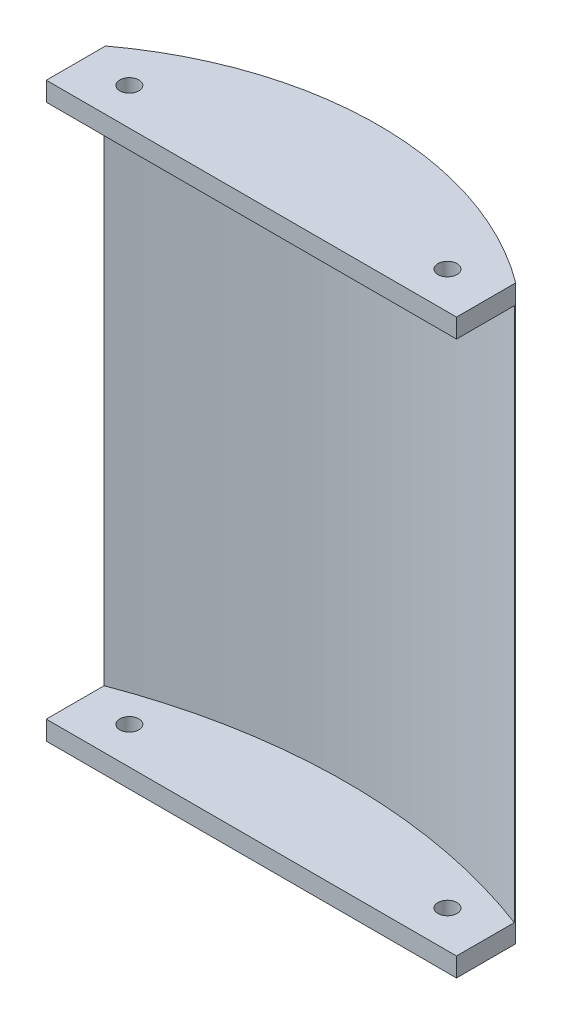
ISO-10303-21;
HEADER;
FILE_DESCRIPTION(('STEP AP214'),'2;1');
FILE_NAME('part.step','',(''),(''),'','','');
FILE_SCHEMA(('AUTOMOTIVE_DESIGN { 1 0 10303 214 1 1 1 1 }'));
ENDSEC;
DATA;
#1=APPLICATION_CONTEXT('core data for automotive mechanical design processes');
#2=APPLICATION_PROTOCOL_DEFINITION('international standard','automotive_design',2000,#1);
#3=PRODUCT_CONTEXT('',#1,'mechanical');
#4=PRODUCT('Part','Part','',(#3));
#5=PRODUCT_RELATED_PRODUCT_CATEGORY('part','',(#4));
#6=PRODUCT_DEFINITION_FORMATION('','',#4);
#7=PRODUCT_DEFINITION_CONTEXT('part definition',#1,'design');
#8=PRODUCT_DEFINITION('design','',#6,#7);
#9=PRODUCT_DEFINITION_SHAPE('','',#8);
#10=(LENGTH_UNIT() NAMED_UNIT(*) SI_UNIT(.MILLI.,.METRE.));
#11=(NAMED_UNIT(*) PLANE_ANGLE_UNIT() SI_UNIT($,.RADIAN.));
#12=(NAMED_UNIT(*) SI_UNIT($,.STERADIAN.) SOLID_ANGLE_UNIT());
#13=UNCERTAINTY_MEASURE_WITH_UNIT(LENGTH_MEASURE(1.E-05),#10,'distance_accuracy_value','');
#14=(GEOMETRIC_REPRESENTATION_CONTEXT(3) GLOBAL_UNCERTAINTY_ASSIGNED_CONTEXT((#13)) GLOBAL_UNIT_ASSIGNED_CONTEXT((#10,
#11,#12)) REPRESENTATION_CONTEXT('',''));
#15=CARTESIAN_POINT('',(0.,0.,0.));
#16=DIRECTION('',(0.,0.,1.));
#17=DIRECTION('',(1.,0.,0.));
#18=AXIS2_PLACEMENT_3D('',#15,#16,#17);
#19=CARTESIAN_POINT('',(64.5,90.,0.));
#20=DIRECTION('',(-1.,0.,0.));
#21=DIRECTION('',(0.,0.,1.));
#22=AXIS2_PLACEMENT_3D('',#19,#20,#21);
#23=PLANE('',#22);
#24=DIRECTION('',(0.,0.,1.));
#25=VECTOR('',#24,1.);
#26=CARTESIAN_POINT('',(64.5,87.,0.));
#27=LINE('',#26,#25);
#28=CARTESIAN_POINT('',(64.5,87.,-9.09369835657632));
#29=VERTEX_POINT('',#28);
#30=CARTESIAN_POINT('',(64.5,87.,0.));
#31=VERTEX_POINT('',#30);
#32=EDGE_CURVE('E139',#29,#31,#27,.T.);
#33=ORIENTED_EDGE('',*,*,#32,.F.);
#34=DIRECTION('',(0.,1.,0.));
#35=VECTOR('',#34,1.);
#36=CARTESIAN_POINT('',(64.5,87.,-9.09369835657632));
#37=LINE('',#36,#35);
#38=CARTESIAN_POINT('',(64.5,2.99999999999999,-9.09369835657632));
#39=VERTEX_POINT('',#38);
#40=EDGE_CURVE('E131',#29,#39,#37,.F.);
#41=ORIENTED_EDGE('',*,*,#40,.T.);
#42=DIRECTION('',(0.,0.,1.));
#43=VECTOR('',#42,1.);
#44=CARTESIAN_POINT('',(64.5,2.99999999999999,0.));
#45=LINE('',#44,#43);
#46=CARTESIAN_POINT('',(64.5,2.99999999999999,0.));
#47=VERTEX_POINT('',#46);
#48=EDGE_CURVE('E119',#39,#47,#45,.T.);
#49=ORIENTED_EDGE('',*,*,#48,.T.);
#50=DIRECTION('',(0.,-1.,0.));
#51=VECTOR('',#50,1.);
#52=CARTESIAN_POINT('',(64.5,90.,0.));
#53=LINE('',#52,#51);
#54=CARTESIAN_POINT('',(64.5,0.,0.));
#55=VERTEX_POINT('',#54);
#56=EDGE_CURVE('E92',#47,#55,#53,.T.);
#57=ORIENTED_EDGE('',*,*,#56,.T.);
#58=DIRECTION('',(0.,0.,-1.));
#59=VECTOR('',#58,1.);
#60=CARTESIAN_POINT('',(64.5,0.,0.));
#61=LINE('',#60,#59);
#62=CARTESIAN_POINT('',(64.5,0.,-9.3120941539427));
#63=VERTEX_POINT('',#62);
#64=EDGE_CURVE('E141',#55,#63,#61,.T.);
#65=ORIENTED_EDGE('',*,*,#64,.T.);
#66=DIRECTION('',(0.,-1.,0.));
#67=VECTOR('',#66,1.);
#68=CARTESIAN_POINT('',(64.5,90.,-9.3120941539427));
#69=LINE('',#68,#67);
#70=CARTESIAN_POINT('',(64.5,90.,-9.3120941539427));
#71=VERTEX_POINT('',#70);
#72=EDGE_CURVE('E182',#71,#63,#69,.T.);
#73=ORIENTED_EDGE('',*,*,#72,.F.);
#74=DIRECTION('',(0.,0.,-1.));
#75=VECTOR('',#74,1.);
#76=CARTESIAN_POINT('',(64.5,90.,0.));
#77=LINE('',#76,#75);
#78=CARTESIAN_POINT('',(64.5,90.,0.));
#79=VERTEX_POINT('',#78);
#80=EDGE_CURVE('E150',#79,#71,#77,.T.);
#81=ORIENTED_EDGE('',*,*,#80,.F.);
#82=EDGE_CURVE('E171',#79,#31,#53,.T.);
#83=ORIENTED_EDGE('',*,*,#82,.T.);
#84=EDGE_LOOP('',(#33,#41,#49,#57,#65,#73,#81,#83));
#85=FACE_BOUND('',#84,.T.);
#86=ADVANCED_FACE('F43',(#85),#23,.F.);
#87=CARTESIAN_POINT('',(0.,90.,0.));
#88=DIRECTION('',(-1.,0.,0.));
#89=DIRECTION('',(0.,0.,1.));
#90=AXIS2_PLACEMENT_3D('',#87,#88,#89);
#91=PLANE('',#90);
#92=DIRECTION('',(0.,1.,0.));
#93=VECTOR('',#92,1.);
#94=CARTESIAN_POINT('',(0.,87.,-9.09369835657632));
#95=LINE('',#94,#93);
#96=CARTESIAN_POINT('',(0.,87.,-9.09369835657632));
#97=VERTEX_POINT('',#96);
#98=CARTESIAN_POINT('',(0.,2.99999999999999,-9.09369835657632));
#99=VERTEX_POINT('',#98);
#100=EDGE_CURVE('E11',#97,#99,#95,.F.);
#101=ORIENTED_EDGE('',*,*,#100,.F.);
#102=DIRECTION('',(0.,0.,1.));
#103=VECTOR('',#102,1.);
#104=CARTESIAN_POINT('',(0.,87.,0.));
#105=LINE('',#104,#103);
#106=CARTESIAN_POINT('',(0.,87.,0.));
#107=VERTEX_POINT('',#106);
#108=EDGE_CURVE('E126',#97,#107,#105,.T.);
#109=ORIENTED_EDGE('',*,*,#108,.T.);
#110=DIRECTION('',(0.,-1.,0.));
#111=VECTOR('',#110,1.);
#112=CARTESIAN_POINT('',(0.,90.,0.));
#113=LINE('',#112,#111);
#114=CARTESIAN_POINT('',(0.,90.,0.));
#115=VERTEX_POINT('',#114);
#116=EDGE_CURVE('E175',#115,#107,#113,.T.);
#117=ORIENTED_EDGE('',*,*,#116,.F.);
#118=DIRECTION('',(0.,0.,-1.));
#119=VECTOR('',#118,1.);
#120=CARTESIAN_POINT('',(0.,90.,0.));
#121=LINE('',#120,#119);
#122=CARTESIAN_POINT('',(0.,90.,-9.31209415394272));
#123=VERTEX_POINT('',#122);
#124=EDGE_CURVE('E156',#115,#123,#121,.T.);
#125=ORIENTED_EDGE('',*,*,#124,.T.);
#126=DIRECTION('',(0.,-1.,0.));
#127=VECTOR('',#126,1.);
#128=CARTESIAN_POINT('',(0.,90.,-9.31209415394272));
#129=LINE('',#128,#127);
#130=CARTESIAN_POINT('',(0.,0.,-9.31209415394272));
#131=VERTEX_POINT('',#130);
#132=EDGE_CURVE('E179',#123,#131,#129,.T.);
#133=ORIENTED_EDGE('',*,*,#132,.T.);
#134=DIRECTION('',(0.,0.,-1.));
#135=VECTOR('',#134,1.);
#136=CARTESIAN_POINT('',(0.,0.,0.));
#137=LINE('',#136,#135);
#138=CARTESIAN_POINT('',(0.,0.,0.));
#139=VERTEX_POINT('',#138);
#140=EDGE_CURVE('E165',#139,#131,#137,.T.);
#141=ORIENTED_EDGE('',*,*,#140,.F.);
#142=CARTESIAN_POINT('',(0.,3.00000000000002,0.));
#143=VERTEX_POINT('',#142);
#144=EDGE_CURVE('E174',#143,#139,#113,.T.);
#145=ORIENTED_EDGE('',*,*,#144,.F.);
#146=DIRECTION('',(0.,0.,1.));
#147=VECTOR('',#146,1.);
#148=CARTESIAN_POINT('',(0.,2.99999999999999,0.));
#149=LINE('',#148,#147);
#150=EDGE_CURVE('E60',#99,#143,#149,.T.);
#151=ORIENTED_EDGE('',*,*,#150,.F.);
#152=EDGE_LOOP('',(#101,#109,#117,#125,#133,#141,#145,#151));
#153=FACE_BOUND('',#152,.T.);
#154=ADVANCED_FACE('F226',(#153),#91,.T.);
#155=CARTESIAN_POINT('',(0.,90.,0.));
#156=DIRECTION('',(0.,0.,-1.));
#157=DIRECTION('',(-1.,0.,0.));
#158=AXIS2_PLACEMENT_3D('',#155,#156,#157);
#159=PLANE('',#158);
#160=DIRECTION('',(-1.,0.,0.));
#161=VECTOR('',#160,1.);
#162=CARTESIAN_POINT('',(0.,87.,0.));
#163=LINE('',#162,#161);
#164=EDGE_CURVE('E52',#31,#107,#163,.T.);
#165=ORIENTED_EDGE('',*,*,#164,.F.);
#166=ORIENTED_EDGE('',*,*,#82,.F.);
#167=DIRECTION('',(1.,0.,0.));
#168=VECTOR('',#167,1.);
#169=CARTESIAN_POINT('',(0.,90.,0.));
#170=LINE('',#169,#168);
#171=EDGE_CURVE('E69',#115,#79,#170,.T.);
#172=ORIENTED_EDGE('',*,*,#171,.F.);
#173=ORIENTED_EDGE('',*,*,#116,.T.);
#174=EDGE_LOOP('',(#165,#166,#172,#173));
#175=FACE_BOUND('',#174,.T.);
#176=ADVANCED_FACE('F230',(#175),#159,.F.);
#177=CARTESIAN_POINT('',(32.25,90.,34.));
#178=DIRECTION('',(0.,-1.,0.));
#179=DIRECTION('',(0.,0.,-1.));
#180=AXIS2_PLACEMENT_3D('',#177,#178,#179);
#181=CYLINDRICAL_SURFACE('',#180,54.);
#182=CARTESIAN_POINT('',(32.25,0.,34.));
#183=DIRECTION('',(0.,1.,0.));
#184=DIRECTION('',(0.,0.,1.));
#185=AXIS2_PLACEMENT_3D('',#182,#183,#184);
#186=CIRCLE('',#185,54.);
#187=EDGE_CURVE('E145',#63,#131,#186,.T.);
#188=ORIENTED_EDGE('',*,*,#187,.T.);
#189=ORIENTED_EDGE('',*,*,#132,.F.);
#190=CARTESIAN_POINT('',(32.25,90.,34.));
#191=DIRECTION('',(0.,1.,0.));
#192=DIRECTION('',(0.,0.,1.));
#193=AXIS2_PLACEMENT_3D('',#190,#191,#192);
#194=CIRCLE('',#193,54.);
#195=EDGE_CURVE('E100',#71,#123,#194,.T.);
#196=ORIENTED_EDGE('',*,*,#195,.F.);
#197=ORIENTED_EDGE('',*,*,#72,.T.);
#198=EDGE_LOOP('',(#188,#189,#196,#197));
#199=FACE_BOUND('',#198,.T.);
#200=ADVANCED_FACE('F235',(#199),#181,.T.);
#201=ORIENTED_EDGE('',*,*,#56,.F.);
#202=DIRECTION('',(-1.,0.,0.));
#203=VECTOR('',#202,1.);
#204=CARTESIAN_POINT('',(0.,2.99999999999999,0.));
#205=LINE('',#204,#203);
#206=EDGE_CURVE('E123',#47,#143,#205,.T.);
#207=ORIENTED_EDGE('',*,*,#206,.T.);
#208=ORIENTED_EDGE('',*,*,#144,.T.);
#209=DIRECTION('',(1.,0.,0.));
#210=VECTOR('',#209,1.);
#211=CARTESIAN_POINT('',(0.,0.,0.));
#212=LINE('',#211,#210);
#213=EDGE_CURVE('E153',#139,#55,#212,.T.);
#214=ORIENTED_EDGE('',*,*,#213,.T.);
#215=EDGE_LOOP('',(#201,#207,#208,#214));
#216=FACE_BOUND('',#215,.T.);
#217=ADVANCED_FACE('F242',(#216),#159,.F.);
#218=CARTESIAN_POINT('',(32.25,90.,34.));
#219=DIRECTION('',(0.,1.,0.));
#220=DIRECTION('',(0.,0.,1.));
#221=AXIS2_PLACEMENT_3D('',#218,#219,#220);
#222=PLANE('',#221);
#223=CARTESIAN_POINT('',(7.24,90.,-5.82));
#224=DIRECTION('',(0.,1.,0.));
#225=DIRECTION('',(0.,0.,1.));
#226=AXIS2_PLACEMENT_3D('',#223,#224,#225);
#227=CIRCLE('',#226,1.5);
#228=CARTESIAN_POINT('',(7.24,90.,-4.32));
#229=VERTEX_POINT('',#228);
#230=EDGE_CURVE('E200',#229,#229,#227,.T.);
#231=ORIENTED_EDGE('',*,*,#230,.F.);
#232=EDGE_LOOP('',(#231));
#233=FACE_BOUND('',#232,.T.);
#234=CARTESIAN_POINT('',(57.26,90.,-5.82));
#235=DIRECTION('',(0.,1.,0.));
#236=DIRECTION('',(0.,0.,1.));
#237=AXIS2_PLACEMENT_3D('',#234,#235,#236);
#238=CIRCLE('',#237,1.5);
#239=CARTESIAN_POINT('',(57.26,90.,-4.31999999999999));
#240=VERTEX_POINT('',#239);
#241=EDGE_CURVE('E206',#240,#240,#238,.T.);
#242=ORIENTED_EDGE('',*,*,#241,.F.);
#243=EDGE_LOOP('',(#242));
#244=FACE_BOUND('',#243,.T.);
#245=ORIENTED_EDGE('',*,*,#80,.T.);
#246=ORIENTED_EDGE('',*,*,#195,.T.);
#247=ORIENTED_EDGE('',*,*,#124,.F.);
#248=ORIENTED_EDGE('',*,*,#171,.T.);
#249=EDGE_LOOP('',(#245,#246,#247,#248));
#250=FACE_BOUND('',#249,.T.);
#251=ADVANCED_FACE('F232',(#233,#244,#250),#222,.T.);
#252=CARTESIAN_POINT('',(32.25,0.,34.));
#253=DIRECTION('',(0.,1.,0.));
#254=DIRECTION('',(0.,0.,1.));
#255=AXIS2_PLACEMENT_3D('',#252,#253,#254);
#256=PLANE('',#255);
#257=CARTESIAN_POINT('',(7.24,0.,-5.82));
#258=DIRECTION('',(0.,1.,0.));
#259=DIRECTION('',(0.,0.,1.));
#260=AXIS2_PLACEMENT_3D('',#257,#258,#259);
#261=CIRCLE('',#260,1.5);
#262=CARTESIAN_POINT('',(7.24,0.,-4.32));
#263=VERTEX_POINT('',#262);
#264=EDGE_CURVE('E192',#263,#263,#261,.T.);
#265=ORIENTED_EDGE('',*,*,#264,.T.);
#266=EDGE_LOOP('',(#265));
#267=FACE_BOUND('',#266,.T.);
#268=CARTESIAN_POINT('',(57.26,0.,-5.82));
#269=DIRECTION('',(0.,1.,0.));
#270=DIRECTION('',(0.,0.,1.));
#271=AXIS2_PLACEMENT_3D('',#268,#269,#270);
#272=CIRCLE('',#271,1.5);
#273=CARTESIAN_POINT('',(57.26,0.,-4.31999999999999));
#274=VERTEX_POINT('',#273);
#275=EDGE_CURVE('E212',#274,#274,#272,.T.);
#276=ORIENTED_EDGE('',*,*,#275,.T.);
#277=EDGE_LOOP('',(#276));
#278=FACE_BOUND('',#277,.T.);
#279=ORIENTED_EDGE('',*,*,#64,.F.);
#280=ORIENTED_EDGE('',*,*,#213,.F.);
#281=ORIENTED_EDGE('',*,*,#140,.T.);
#282=ORIENTED_EDGE('',*,*,#187,.F.);
#283=EDGE_LOOP('',(#279,#280,#281,#282));
#284=FACE_BOUND('',#283,.T.);
#285=ADVANCED_FACE('F240',(#267,#278,#284),#256,.F.);
#286=CARTESIAN_POINT('',(32.25,87.,76.));
#287=DIRECTION('',(0.,1.,0.));
#288=DIRECTION('',(0.,0.,1.));
#289=AXIS2_PLACEMENT_3D('',#286,#287,#288);
#290=CYLINDRICAL_SURFACE('',#289,91.);
#291=CARTESIAN_POINT('',(32.25,87.,76.));
#292=DIRECTION('',(0.,1.,0.));
#293=DIRECTION('',(0.,0.,1.));
#294=AXIS2_PLACEMENT_3D('',#291,#292,#293);
#295=CIRCLE('',#294,91.);
#296=EDGE_CURVE('E135',#29,#97,#295,.T.);
#297=ORIENTED_EDGE('',*,*,#296,.T.);
#298=ORIENTED_EDGE('',*,*,#100,.T.);
#299=CARTESIAN_POINT('',(32.25,2.99999999999999,76.));
#300=DIRECTION('',(0.,1.,0.));
#301=DIRECTION('',(0.,0.,1.));
#302=AXIS2_PLACEMENT_3D('',#299,#300,#301);
#303=CIRCLE('',#302,91.);
#304=EDGE_CURVE('E122',#39,#99,#303,.T.);
#305=ORIENTED_EDGE('',*,*,#304,.F.);
#306=ORIENTED_EDGE('',*,*,#40,.F.);
#307=EDGE_LOOP('',(#297,#298,#305,#306));
#308=FACE_BOUND('',#307,.T.);
#309=ADVANCED_FACE('F130',(#308),#290,.F.);
#310=CARTESIAN_POINT('',(32.25,87.,0.));
#311=DIRECTION('',(0.,-1.,0.));
#312=DIRECTION('',(0.,0.,-1.));
#313=AXIS2_PLACEMENT_3D('',#310,#311,#312);
#314=PLANE('',#313);
#315=CARTESIAN_POINT('',(7.24,87.,-5.82));
#316=DIRECTION('',(0.,-1.,0.));
#317=DIRECTION('',(0.,0.,-1.));
#318=AXIS2_PLACEMENT_3D('',#315,#316,#317);
#319=CIRCLE('',#318,1.5);
#320=CARTESIAN_POINT('',(7.24,87.,-4.32));
#321=VERTEX_POINT('',#320);
#322=EDGE_CURVE('E216',#321,#321,#319,.T.);
#323=ORIENTED_EDGE('',*,*,#322,.F.);
#324=EDGE_LOOP('',(#323));
#325=FACE_BOUND('',#324,.T.);
#326=CARTESIAN_POINT('',(57.26,87.,-5.82));
#327=DIRECTION('',(0.,-1.,0.));
#328=DIRECTION('',(0.,0.,-1.));
#329=AXIS2_PLACEMENT_3D('',#326,#327,#328);
#330=CIRCLE('',#329,1.5);
#331=CARTESIAN_POINT('',(57.26,87.,-4.31999999999999));
#332=VERTEX_POINT('',#331);
#333=EDGE_CURVE('E191',#332,#332,#330,.T.);
#334=ORIENTED_EDGE('',*,*,#333,.F.);
#335=EDGE_LOOP('',(#334));
#336=FACE_BOUND('',#335,.T.);
#337=ORIENTED_EDGE('',*,*,#32,.T.);
#338=ORIENTED_EDGE('',*,*,#164,.T.);
#339=ORIENTED_EDGE('',*,*,#108,.F.);
#340=ORIENTED_EDGE('',*,*,#296,.F.);
#341=EDGE_LOOP('',(#337,#338,#339,#340));
#342=FACE_BOUND('',#341,.T.);
#343=ADVANCED_FACE('F290',(#325,#336,#342),#314,.T.);
#344=CARTESIAN_POINT('',(32.25,2.99999999999999,0.));
#345=DIRECTION('',(0.,-1.,0.));
#346=DIRECTION('',(0.,0.,-1.));
#347=AXIS2_PLACEMENT_3D('',#344,#345,#346);
#348=PLANE('',#347);
#349=CARTESIAN_POINT('',(7.24,2.99999999999999,-5.82));
#350=DIRECTION('',(0.,-1.,0.));
#351=DIRECTION('',(0.,0.,-1.));
#352=AXIS2_PLACEMENT_3D('',#349,#350,#351);
#353=CIRCLE('',#352,1.5);
#354=CARTESIAN_POINT('',(7.24,2.99999999999999,-4.32));
#355=VERTEX_POINT('',#354);
#356=EDGE_CURVE('E46',#355,#355,#353,.T.);
#357=ORIENTED_EDGE('',*,*,#356,.T.);
#358=EDGE_LOOP('',(#357));
#359=FACE_BOUND('',#358,.T.);
#360=CARTESIAN_POINT('',(57.26,2.99999999999999,-5.82));
#361=DIRECTION('',(0.,-1.,0.));
#362=DIRECTION('',(0.,0.,-1.));
#363=AXIS2_PLACEMENT_3D('',#360,#361,#362);
#364=CIRCLE('',#363,1.5);
#365=CARTESIAN_POINT('',(57.26,2.99999999999999,-4.31999999999999));
#366=VERTEX_POINT('',#365);
#367=EDGE_CURVE('E188',#366,#366,#364,.T.);
#368=ORIENTED_EDGE('',*,*,#367,.T.);
#369=EDGE_LOOP('',(#368));
#370=FACE_BOUND('',#369,.T.);
#371=ORIENTED_EDGE('',*,*,#304,.T.);
#372=ORIENTED_EDGE('',*,*,#150,.T.);
#373=ORIENTED_EDGE('',*,*,#206,.F.);
#374=ORIENTED_EDGE('',*,*,#48,.F.);
#375=EDGE_LOOP('',(#371,#372,#373,#374));
#376=FACE_BOUND('',#375,.T.);
#377=ADVANCED_FACE('F121',(#359,#370,#376),#348,.F.);
#378=CARTESIAN_POINT('',(57.26,0.,-5.82));
#379=DIRECTION('',(0.,1.,0.));
#380=DIRECTION('',(0.,0.,1.));
#381=AXIS2_PLACEMENT_3D('',#378,#379,#380);
#382=CYLINDRICAL_SURFACE('',#381,1.5);
#383=CARTESIAN_POINT('',(57.26,0.,-4.31999999999999));
#384=CARTESIAN_POINT('',(57.26,0.03125,-4.31999999999999));
#385=CARTESIAN_POINT('',(57.26,0.0624999999999999,-4.31999999999999));
#386=CARTESIAN_POINT('',(57.26,0.125,-4.31999999999999));
#387=CARTESIAN_POINT('',(57.26,0.15625,-4.31999999999999));
#388=CARTESIAN_POINT('',(57.26,0.21875,-4.31999999999999));
#389=CARTESIAN_POINT('',(57.26,0.249999999999999,-4.31999999999999));
#390=CARTESIAN_POINT('',(57.26,0.312499999999999,-4.31999999999999));
#391=CARTESIAN_POINT('',(57.26,0.343749999999999,-4.31999999999999));
#392=CARTESIAN_POINT('',(57.26,0.406249999999999,-4.31999999999999));
#393=CARTESIAN_POINT('',(57.26,0.437499999999999,-4.31999999999999));
#394=CARTESIAN_POINT('',(57.26,0.499999999999999,-4.31999999999999));
#395=CARTESIAN_POINT('',(57.26,0.531249999999999,-4.31999999999999));
#396=CARTESIAN_POINT('',(57.26,0.593749999999999,-4.31999999999999));
#397=CARTESIAN_POINT('',(57.26,0.624999999999998,-4.31999999999999));
#398=CARTESIAN_POINT('',(57.26,0.687499999999998,-4.31999999999999));
#399=CARTESIAN_POINT('',(57.26,0.718749999999998,-4.31999999999999));
#400=CARTESIAN_POINT('',(57.26,0.781249999999998,-4.31999999999999));
#401=CARTESIAN_POINT('',(57.26,0.812499999999998,-4.31999999999999));
#402=CARTESIAN_POINT('',(57.26,0.874999999999998,-4.31999999999999));
#403=CARTESIAN_POINT('',(57.26,0.906249999999998,-4.31999999999999));
#404=CARTESIAN_POINT('',(57.26,0.968749999999998,-4.31999999999999));
#405=CARTESIAN_POINT('',(57.26,0.999999999999997,-4.31999999999999));
#406=CARTESIAN_POINT('',(57.26,1.0625,-4.31999999999999));
#407=CARTESIAN_POINT('',(57.26,1.09375,-4.31999999999999));
#408=CARTESIAN_POINT('',(57.26,1.15625,-4.31999999999999));
#409=CARTESIAN_POINT('',(57.26,1.1875,-4.31999999999999));
#410=CARTESIAN_POINT('',(57.26,1.25,-4.31999999999999));
#411=CARTESIAN_POINT('',(57.26,1.28125,-4.31999999999999));
#412=CARTESIAN_POINT('',(57.26,1.34375,-4.31999999999999));
#413=CARTESIAN_POINT('',(57.26,1.375,-4.31999999999999));
#414=CARTESIAN_POINT('',(57.26,1.4375,-4.31999999999999));
#415=CARTESIAN_POINT('',(57.26,1.46875,-4.31999999999999));
#416=CARTESIAN_POINT('',(57.26,1.53125,-4.31999999999999));
#417=CARTESIAN_POINT('',(57.26,1.5625,-4.31999999999999));
#418=CARTESIAN_POINT('',(57.26,1.625,-4.31999999999999));
#419=CARTESIAN_POINT('',(57.26,1.65625,-4.31999999999999));
#420=CARTESIAN_POINT('',(57.26,1.71875,-4.31999999999999));
#421=CARTESIAN_POINT('',(57.26,1.75,-4.31999999999999));
#422=CARTESIAN_POINT('',(57.26,1.8125,-4.31999999999999));
#423=CARTESIAN_POINT('',(57.26,1.84375,-4.31999999999999));
#424=CARTESIAN_POINT('',(57.26,1.90625,-4.31999999999999));
#425=CARTESIAN_POINT('',(57.26,1.9375,-4.31999999999999));
#426=CARTESIAN_POINT('',(57.26,2.,-4.31999999999999));
#427=CARTESIAN_POINT('',(57.26,2.03124999999999,-4.31999999999999));
#428=CARTESIAN_POINT('',(57.26,2.09375,-4.31999999999999));
#429=CARTESIAN_POINT('',(57.26,2.12499999999999,-4.31999999999999));
#430=CARTESIAN_POINT('',(57.26,2.18749999999999,-4.31999999999999));
#431=CARTESIAN_POINT('',(57.26,2.21874999999999,-4.31999999999999));
#432=CARTESIAN_POINT('',(57.26,2.28124999999999,-4.31999999999999));
#433=CARTESIAN_POINT('',(57.26,2.31249999999999,-4.31999999999999));
#434=CARTESIAN_POINT('',(57.26,2.37499999999999,-4.31999999999999));
#435=CARTESIAN_POINT('',(57.26,2.40624999999999,-4.31999999999999));
#436=CARTESIAN_POINT('',(57.26,2.46874999999999,-4.31999999999999));
#437=CARTESIAN_POINT('',(57.26,2.49999999999999,-4.31999999999999));
#438=CARTESIAN_POINT('',(57.26,2.56249999999999,-4.31999999999999));
#439=CARTESIAN_POINT('',(57.26,2.59374999999999,-4.31999999999999));
#440=CARTESIAN_POINT('',(57.26,2.65624999999999,-4.31999999999999));
#441=CARTESIAN_POINT('',(57.26,2.68749999999999,-4.31999999999999));
#442=CARTESIAN_POINT('',(57.26,2.74999999999999,-4.31999999999999));
#443=CARTESIAN_POINT('',(57.26,2.78124999999999,-4.31999999999999));
#444=CARTESIAN_POINT('',(57.26,2.84374999999999,-4.31999999999999));
#445=CARTESIAN_POINT('',(57.26,2.87499999999999,-4.31999999999999));
#446=CARTESIAN_POINT('',(57.26,2.93749999999999,-4.31999999999999));
#447=CARTESIAN_POINT('',(57.26,2.96874999999999,-4.31999999999999));
#448=CARTESIAN_POINT('',(57.26,2.99999999999999,-4.31999999999999));
#449=B_SPLINE_CURVE_WITH_KNOTS('',3,(#383,#384,#385,#386,#387,#388,#389,#390,#391,#392,#393,
#394,#395,#396,#397,#398,#399,#400,#401,#402,#403,#404,#405,#406,#407,#408,#409,#410,#411,#412,
#413,#414,#415,#416,#417,#418,#419,#420,#421,#422,#423,#424,#425,#426,#427,#428,#429,#430,#431,
#432,#433,#434,#435,#436,#437,#438,#439,#440,#441,#442,#443,#444,#445,#446,#447,#448),
.UNSPECIFIED.,.F.,.F.,(4,2,2,2,2,2,2,2,2,2,2,2,2,2,2,2,2,2,2,2,2,2,2,2,2,2,2,2,2,2,2,2,4),(0.,
0.0937499999999998,0.1875,0.281249999999999,0.374999999999999,0.468749999999999,
0.562499999999999,0.656249999999998,0.749999999999998,0.843749999999998,0.937499999999998,
1.03125,1.125,1.21875,1.3125,1.40625,1.5,1.59375,1.6875,1.78125,1.875,1.96875,2.06249999999999,
2.15624999999999,2.24999999999999,2.34374999999999,2.43749999999999,2.53124999999999,
2.62499999999999,2.71874999999999,2.81249999999999,2.90624999999999,2.99999999999999),.UNSPECIFIED.);
#450=EDGE_CURVE('BSEAM308',#274,#366,#449,.T.);
#451=ORIENTED_EDGE('',*,*,#275,.F.);
#452=ORIENTED_EDGE('',*,*,#367,.F.);
#453=ORIENTED_EDGE('',*,*,#450,.T.);
#454=ORIENTED_EDGE('',*,*,#450,.F.);
#455=EDGE_LOOP('',(#451,#453,#452,#454));
#456=FACE_BOUND('',#455,.T.);
#457=ADVANCED_FACE('F308',(#456),#382,.F.);
#458=CARTESIAN_POINT('',(7.24,0.,-5.82));
#459=DIRECTION('',(0.,1.,0.));
#460=DIRECTION('',(0.,0.,1.));
#461=AXIS2_PLACEMENT_3D('',#458,#459,#460);
#462=CYLINDRICAL_SURFACE('',#461,1.5);
#463=CARTESIAN_POINT('',(7.24,0.,-4.32));
#464=CARTESIAN_POINT('',(7.24,0.03125,-4.32));
#465=CARTESIAN_POINT('',(7.24,0.0624999999999999,-4.32));
#466=CARTESIAN_POINT('',(7.24,0.125,-4.32));
#467=CARTESIAN_POINT('',(7.24,0.15625,-4.32));
#468=CARTESIAN_POINT('',(7.24,0.21875,-4.32));
#469=CARTESIAN_POINT('',(7.24,0.249999999999999,-4.32));
#470=CARTESIAN_POINT('',(7.24,0.312499999999999,-4.32));
#471=CARTESIAN_POINT('',(7.24,0.343749999999999,-4.32));
#472=CARTESIAN_POINT('',(7.24,0.406249999999999,-4.32));
#473=CARTESIAN_POINT('',(7.24,0.437499999999999,-4.32));
#474=CARTESIAN_POINT('',(7.24,0.499999999999999,-4.32));
#475=CARTESIAN_POINT('',(7.24,0.531249999999999,-4.32));
#476=CARTESIAN_POINT('',(7.24,0.593749999999999,-4.32));
#477=CARTESIAN_POINT('',(7.24,0.624999999999998,-4.32));
#478=CARTESIAN_POINT('',(7.24,0.687499999999998,-4.32));
#479=CARTESIAN_POINT('',(7.24,0.718749999999998,-4.32));
#480=CARTESIAN_POINT('',(7.24,0.781249999999998,-4.32));
#481=CARTESIAN_POINT('',(7.24,0.812499999999998,-4.32));
#482=CARTESIAN_POINT('',(7.24,0.874999999999998,-4.32));
#483=CARTESIAN_POINT('',(7.24,0.906249999999998,-4.32));
#484=CARTESIAN_POINT('',(7.24,0.968749999999998,-4.32));
#485=CARTESIAN_POINT('',(7.24,0.999999999999997,-4.32));
#486=CARTESIAN_POINT('',(7.24,1.0625,-4.32));
#487=CARTESIAN_POINT('',(7.24,1.09375,-4.32));
#488=CARTESIAN_POINT('',(7.24,1.15625,-4.32));
#489=CARTESIAN_POINT('',(7.24,1.1875,-4.32));
#490=CARTESIAN_POINT('',(7.24,1.25,-4.32));
#491=CARTESIAN_POINT('',(7.24,1.28125,-4.32));
#492=CARTESIAN_POINT('',(7.24,1.34375,-4.32));
#493=CARTESIAN_POINT('',(7.24,1.375,-4.32));
#494=CARTESIAN_POINT('',(7.24,1.4375,-4.32));
#495=CARTESIAN_POINT('',(7.24,1.46875,-4.32));
#496=CARTESIAN_POINT('',(7.24,1.53125,-4.32));
#497=CARTESIAN_POINT('',(7.24,1.5625,-4.32));
#498=CARTESIAN_POINT('',(7.24,1.625,-4.32));
#499=CARTESIAN_POINT('',(7.24,1.65625,-4.32));
#500=CARTESIAN_POINT('',(7.24,1.71875,-4.32));
#501=CARTESIAN_POINT('',(7.24,1.75,-4.32));
#502=CARTESIAN_POINT('',(7.24,1.8125,-4.32));
#503=CARTESIAN_POINT('',(7.24,1.84375,-4.32));
#504=CARTESIAN_POINT('',(7.24,1.90625,-4.32));
#505=CARTESIAN_POINT('',(7.24,1.9375,-4.32));
#506=CARTESIAN_POINT('',(7.24,2.,-4.32));
#507=CARTESIAN_POINT('',(7.24,2.03124999999999,-4.32));
#508=CARTESIAN_POINT('',(7.24,2.09375,-4.32));
#509=CARTESIAN_POINT('',(7.24,2.12499999999999,-4.32));
#510=CARTESIAN_POINT('',(7.24,2.18749999999999,-4.32));
#511=CARTESIAN_POINT('',(7.24,2.21874999999999,-4.32));
#512=CARTESIAN_POINT('',(7.24,2.28124999999999,-4.32));
#513=CARTESIAN_POINT('',(7.24,2.31249999999999,-4.32));
#514=CARTESIAN_POINT('',(7.24,2.37499999999999,-4.32));
#515=CARTESIAN_POINT('',(7.24,2.40624999999999,-4.32));
#516=CARTESIAN_POINT('',(7.24,2.46874999999999,-4.32));
#517=CARTESIAN_POINT('',(7.24,2.49999999999999,-4.32));
#518=CARTESIAN_POINT('',(7.24,2.56249999999999,-4.32));
#519=CARTESIAN_POINT('',(7.24,2.59374999999999,-4.32));
#520=CARTESIAN_POINT('',(7.24,2.65624999999999,-4.32));
#521=CARTESIAN_POINT('',(7.24,2.68749999999999,-4.32));
#522=CARTESIAN_POINT('',(7.24,2.74999999999999,-4.32));
#523=CARTESIAN_POINT('',(7.24,2.78124999999999,-4.32));
#524=CARTESIAN_POINT('',(7.24,2.84374999999999,-4.32));
#525=CARTESIAN_POINT('',(7.24,2.87499999999999,-4.32));
#526=CARTESIAN_POINT('',(7.24,2.93749999999999,-4.32));
#527=CARTESIAN_POINT('',(7.24,2.96874999999999,-4.32));
#528=CARTESIAN_POINT('',(7.24,2.99999999999999,-4.32));
#529=B_SPLINE_CURVE_WITH_KNOTS('',3,(#463,#464,#465,#466,#467,#468,#469,#470,#471,#472,#473,
#474,#475,#476,#477,#478,#479,#480,#481,#482,#483,#484,#485,#486,#487,#488,#489,#490,#491,#492,
#493,#494,#495,#496,#497,#498,#499,#500,#501,#502,#503,#504,#505,#506,#507,#508,#509,#510,#511,
#512,#513,#514,#515,#516,#517,#518,#519,#520,#521,#522,#523,#524,#525,#526,#527,#528),
.UNSPECIFIED.,.F.,.F.,(4,2,2,2,2,2,2,2,2,2,2,2,2,2,2,2,2,2,2,2,2,2,2,2,2,2,2,2,2,2,2,2,4),(0.,
0.0937499999999998,0.1875,0.281249999999999,0.374999999999999,0.468749999999999,
0.562499999999999,0.656249999999998,0.749999999999998,0.843749999999998,0.937499999999998,
1.03125,1.125,1.21875,1.3125,1.40625,1.5,1.59375,1.6875,1.78125,1.875,1.96875,2.06249999999999,
2.15624999999999,2.24999999999999,2.34374999999999,2.43749999999999,2.53124999999999,
2.62499999999999,2.71874999999999,2.81249999999999,2.90624999999999,2.99999999999999),.UNSPECIFIED.);
#530=EDGE_CURVE('BSEAM318',#263,#355,#529,.T.);
#531=ORIENTED_EDGE('',*,*,#264,.F.);
#532=ORIENTED_EDGE('',*,*,#356,.F.);
#533=ORIENTED_EDGE('',*,*,#530,.T.);
#534=ORIENTED_EDGE('',*,*,#530,.F.);
#535=EDGE_LOOP('',(#531,#533,#532,#534));
#536=FACE_BOUND('',#535,.T.);
#537=ADVANCED_FACE('F318',(#536),#462,.F.);
#538=CARTESIAN_POINT('',(57.26,87.,-4.31999999999999));
#539=CARTESIAN_POINT('',(57.26,87.03125,-4.31999999999999));
#540=CARTESIAN_POINT('',(57.26,87.0625,-4.31999999999999));
#541=CARTESIAN_POINT('',(57.26,87.125,-4.31999999999999));
#542=CARTESIAN_POINT('',(57.26,87.15625,-4.31999999999999));
#543=CARTESIAN_POINT('',(57.26,87.21875,-4.31999999999999));
#544=CARTESIAN_POINT('',(57.26,87.25,-4.31999999999999));
#545=CARTESIAN_POINT('',(57.26,87.3125,-4.31999999999999));
#546=CARTESIAN_POINT('',(57.26,87.34375,-4.31999999999999));
#547=CARTESIAN_POINT('',(57.26,87.40625,-4.31999999999999));
#548=CARTESIAN_POINT('',(57.26,87.4375,-4.31999999999999));
#549=CARTESIAN_POINT('',(57.26,87.5,-4.31999999999999));
#550=CARTESIAN_POINT('',(57.26,87.53125,-4.31999999999999));
#551=CARTESIAN_POINT('',(57.26,87.59375,-4.31999999999999));
#552=CARTESIAN_POINT('',(57.26,87.625,-4.31999999999999));
#553=CARTESIAN_POINT('',(57.26,87.6875,-4.31999999999999));
#554=CARTESIAN_POINT('',(57.26,87.71875,-4.31999999999999));
#555=CARTESIAN_POINT('',(57.26,87.78125,-4.31999999999999));
#556=CARTESIAN_POINT('',(57.26,87.8125,-4.31999999999999));
#557=CARTESIAN_POINT('',(57.26,87.875,-4.31999999999999));
#558=CARTESIAN_POINT('',(57.26,87.90625,-4.31999999999999));
#559=CARTESIAN_POINT('',(57.26,87.96875,-4.31999999999999));
#560=CARTESIAN_POINT('',(57.26,88.,-4.31999999999999));
#561=CARTESIAN_POINT('',(57.26,88.0625,-4.31999999999999));
#562=CARTESIAN_POINT('',(57.26,88.09375,-4.31999999999999));
#563=CARTESIAN_POINT('',(57.26,88.15625,-4.31999999999999));
#564=CARTESIAN_POINT('',(57.26,88.1875,-4.31999999999999));
#565=CARTESIAN_POINT('',(57.26,88.25,-4.31999999999999));
#566=CARTESIAN_POINT('',(57.26,88.28125,-4.31999999999999));
#567=CARTESIAN_POINT('',(57.26,88.34375,-4.31999999999999));
#568=CARTESIAN_POINT('',(57.26,88.375,-4.31999999999999));
#569=CARTESIAN_POINT('',(57.26,88.4375,-4.31999999999999));
#570=CARTESIAN_POINT('',(57.26,88.46875,-4.31999999999999));
#571=CARTESIAN_POINT('',(57.26,88.53125,-4.31999999999999));
#572=CARTESIAN_POINT('',(57.26,88.5625,-4.31999999999999));
#573=CARTESIAN_POINT('',(57.26,88.625,-4.31999999999999));
#574=CARTESIAN_POINT('',(57.26,88.65625,-4.31999999999999));
#575=CARTESIAN_POINT('',(57.26,88.71875,-4.31999999999999));
#576=CARTESIAN_POINT('',(57.26,88.75,-4.31999999999999));
#577=CARTESIAN_POINT('',(57.26,88.8125,-4.31999999999999));
#578=CARTESIAN_POINT('',(57.26,88.84375,-4.31999999999999));
#579=CARTESIAN_POINT('',(57.26,88.90625,-4.31999999999999));
#580=CARTESIAN_POINT('',(57.26,88.9375,-4.31999999999999));
#581=CARTESIAN_POINT('',(57.26,89.,-4.31999999999999));
#582=CARTESIAN_POINT('',(57.26,89.03125,-4.31999999999999));
#583=CARTESIAN_POINT('',(57.26,89.09375,-4.31999999999999));
#584=CARTESIAN_POINT('',(57.26,89.125,-4.31999999999999));
#585=CARTESIAN_POINT('',(57.26,89.1875,-4.31999999999999));
#586=CARTESIAN_POINT('',(57.26,89.21875,-4.31999999999999));
#587=CARTESIAN_POINT('',(57.26,89.28125,-4.31999999999999));
#588=CARTESIAN_POINT('',(57.26,89.3125,-4.31999999999999));
#589=CARTESIAN_POINT('',(57.26,89.375,-4.31999999999999));
#590=CARTESIAN_POINT('',(57.26,89.40625,-4.31999999999999));
#591=CARTESIAN_POINT('',(57.26,89.46875,-4.31999999999999));
#592=CARTESIAN_POINT('',(57.26,89.5,-4.31999999999999));
#593=CARTESIAN_POINT('',(57.26,89.5625,-4.31999999999999));
#594=CARTESIAN_POINT('',(57.26,89.59375,-4.31999999999999));
#595=CARTESIAN_POINT('',(57.26,89.65625,-4.31999999999999));
#596=CARTESIAN_POINT('',(57.26,89.6875,-4.31999999999999));
#597=CARTESIAN_POINT('',(57.26,89.75,-4.31999999999999));
#598=CARTESIAN_POINT('',(57.26,89.78125,-4.31999999999999));
#599=CARTESIAN_POINT('',(57.26,89.84375,-4.31999999999999));
#600=CARTESIAN_POINT('',(57.26,89.875,-4.31999999999999));
#601=CARTESIAN_POINT('',(57.26,89.9375,-4.31999999999999));
#602=CARTESIAN_POINT('',(57.26,89.96875,-4.31999999999999));
#603=CARTESIAN_POINT('',(57.26,90.,-4.31999999999999));
#604=B_SPLINE_CURVE_WITH_KNOTS('',3,(#538,#539,#540,#541,#542,#543,#544,#545,#546,#547,#548,
#549,#550,#551,#552,#553,#554,#555,#556,#557,#558,#559,#560,#561,#562,#563,#564,#565,#566,#567,
#568,#569,#570,#571,#572,#573,#574,#575,#576,#577,#578,#579,#580,#581,#582,#583,#584,#585,#586,
#587,#588,#589,#590,#591,#592,#593,#594,#595,#596,#597,#598,#599,#600,#601,#602,#603),
.UNSPECIFIED.,.F.,.F.,(4,2,2,2,2,2,2,2,2,2,2,2,2,2,2,2,2,2,2,2,2,2,2,2,2,2,2,2,2,2,2,2,4),(0.,
0.0937500000000036,0.187499999999993,0.281249999999997,0.375,0.46874999999999,0.562499999999994,
0.656249999999997,0.750000000000001,0.84374999999999,0.937499999999994,1.03125,1.12499999999999,
1.21874999999999,1.31249999999999,1.40624999999998,1.49999999999999,1.59374999999999,
1.68749999999998,1.78124999999998,1.87499999999999,1.96874999999998,2.06249999999998,
2.15624999999998,2.24999999999997,2.34374999999998,2.43749999999998,2.53124999999998,
2.62499999999997,2.71874999999998,2.81249999999998,2.90624999999997,2.99999999999998),.UNSPECIFIED.);
#605=EDGE_CURVE('BSEAM321',#332,#240,#604,.T.);
#606=ORIENTED_EDGE('',*,*,#333,.T.);
#607=ORIENTED_EDGE('',*,*,#241,.T.);
#608=ORIENTED_EDGE('',*,*,#605,.T.);
#609=ORIENTED_EDGE('',*,*,#605,.F.);
#610=EDGE_LOOP('',(#606,#608,#607,#609));
#611=FACE_BOUND('',#610,.T.);
#612=ADVANCED_FACE('F321',(#611),#382,.F.);
#613=CARTESIAN_POINT('',(7.24,87.,-4.32));
#614=CARTESIAN_POINT('',(7.24,87.03125,-4.32));
#615=CARTESIAN_POINT('',(7.24,87.0625,-4.32));
#616=CARTESIAN_POINT('',(7.24,87.125,-4.32));
#617=CARTESIAN_POINT('',(7.24,87.15625,-4.32));
#618=CARTESIAN_POINT('',(7.24,87.21875,-4.32));
#619=CARTESIAN_POINT('',(7.24,87.25,-4.32));
#620=CARTESIAN_POINT('',(7.24,87.3125,-4.32));
#621=CARTESIAN_POINT('',(7.24,87.34375,-4.32));
#622=CARTESIAN_POINT('',(7.24,87.40625,-4.32));
#623=CARTESIAN_POINT('',(7.24,87.4375,-4.32));
#624=CARTESIAN_POINT('',(7.24,87.5,-4.32));
#625=CARTESIAN_POINT('',(7.24,87.53125,-4.32));
#626=CARTESIAN_POINT('',(7.24,87.59375,-4.32));
#627=CARTESIAN_POINT('',(7.24,87.625,-4.32));
#628=CARTESIAN_POINT('',(7.24,87.6875,-4.32));
#629=CARTESIAN_POINT('',(7.24,87.71875,-4.32));
#630=CARTESIAN_POINT('',(7.24,87.78125,-4.32));
#631=CARTESIAN_POINT('',(7.24,87.8125,-4.32));
#632=CARTESIAN_POINT('',(7.24,87.875,-4.32));
#633=CARTESIAN_POINT('',(7.24,87.90625,-4.32));
#634=CARTESIAN_POINT('',(7.24,87.96875,-4.32));
#635=CARTESIAN_POINT('',(7.24,88.,-4.32));
#636=CARTESIAN_POINT('',(7.24,88.0625,-4.32));
#637=CARTESIAN_POINT('',(7.24,88.09375,-4.32));
#638=CARTESIAN_POINT('',(7.24,88.15625,-4.32));
#639=CARTESIAN_POINT('',(7.24,88.1875,-4.32));
#640=CARTESIAN_POINT('',(7.24,88.25,-4.32));
#641=CARTESIAN_POINT('',(7.24,88.28125,-4.32));
#642=CARTESIAN_POINT('',(7.24,88.34375,-4.32));
#643=CARTESIAN_POINT('',(7.24,88.375,-4.32));
#644=CARTESIAN_POINT('',(7.24,88.4375,-4.32));
#645=CARTESIAN_POINT('',(7.24,88.46875,-4.32));
#646=CARTESIAN_POINT('',(7.24,88.53125,-4.32));
#647=CARTESIAN_POINT('',(7.24,88.5625,-4.32));
#648=CARTESIAN_POINT('',(7.24,88.625,-4.32));
#649=CARTESIAN_POINT('',(7.24,88.65625,-4.32));
#650=CARTESIAN_POINT('',(7.24,88.71875,-4.32));
#651=CARTESIAN_POINT('',(7.24,88.75,-4.32));
#652=CARTESIAN_POINT('',(7.24,88.8125,-4.32));
#653=CARTESIAN_POINT('',(7.24,88.84375,-4.32));
#654=CARTESIAN_POINT('',(7.24,88.90625,-4.32));
#655=CARTESIAN_POINT('',(7.24,88.9375,-4.32));
#656=CARTESIAN_POINT('',(7.24,89.,-4.32));
#657=CARTESIAN_POINT('',(7.24,89.03125,-4.32));
#658=CARTESIAN_POINT('',(7.24,89.09375,-4.32));
#659=CARTESIAN_POINT('',(7.24,89.125,-4.32));
#660=CARTESIAN_POINT('',(7.24,89.1875,-4.32));
#661=CARTESIAN_POINT('',(7.24,89.21875,-4.32));
#662=CARTESIAN_POINT('',(7.24,89.28125,-4.32));
#663=CARTESIAN_POINT('',(7.24,89.3125,-4.32));
#664=CARTESIAN_POINT('',(7.24,89.375,-4.32));
#665=CARTESIAN_POINT('',(7.24,89.40625,-4.32));
#666=CARTESIAN_POINT('',(7.24,89.46875,-4.32));
#667=CARTESIAN_POINT('',(7.24,89.5,-4.32));
#668=CARTESIAN_POINT('',(7.24,89.5625,-4.32));
#669=CARTESIAN_POINT('',(7.24,89.59375,-4.32));
#670=CARTESIAN_POINT('',(7.24,89.65625,-4.32));
#671=CARTESIAN_POINT('',(7.24,89.6875,-4.32));
#672=CARTESIAN_POINT('',(7.24,89.75,-4.32));
#673=CARTESIAN_POINT('',(7.24,89.78125,-4.32));
#674=CARTESIAN_POINT('',(7.24,89.84375,-4.32));
#675=CARTESIAN_POINT('',(7.24,89.875,-4.32));
#676=CARTESIAN_POINT('',(7.24,89.9375,-4.32));
#677=CARTESIAN_POINT('',(7.24,89.96875,-4.32));
#678=CARTESIAN_POINT('',(7.24,90.,-4.32));
#679=B_SPLINE_CURVE_WITH_KNOTS('',3,(#613,#614,#615,#616,#617,#618,#619,#620,#621,#622,#623,
#624,#625,#626,#627,#628,#629,#630,#631,#632,#633,#634,#635,#636,#637,#638,#639,#640,#641,#642,
#643,#644,#645,#646,#647,#648,#649,#650,#651,#652,#653,#654,#655,#656,#657,#658,#659,#660,#661,
#662,#663,#664,#665,#666,#667,#668,#669,#670,#671,#672,#673,#674,#675,#676,#677,#678),
.UNSPECIFIED.,.F.,.F.,(4,2,2,2,2,2,2,2,2,2,2,2,2,2,2,2,2,2,2,2,2,2,2,2,2,2,2,2,2,2,2,2,4),(0.,
0.0937500000000036,0.187499999999993,0.281249999999997,0.375,0.46874999999999,0.562499999999994,
0.656249999999997,0.750000000000001,0.84374999999999,0.937499999999994,1.03125,1.12499999999999,
1.21874999999999,1.31249999999999,1.40624999999998,1.49999999999999,1.59374999999999,
1.68749999999998,1.78124999999998,1.87499999999999,1.96874999999998,2.06249999999998,
2.15624999999998,2.24999999999997,2.34374999999998,2.43749999999998,2.53124999999998,
2.62499999999997,2.71874999999998,2.81249999999998,2.90624999999997,2.99999999999998),.UNSPECIFIED.);
#680=EDGE_CURVE('BSEAM331',#321,#229,#679,.T.);
#681=ORIENTED_EDGE('',*,*,#322,.T.);
#682=ORIENTED_EDGE('',*,*,#230,.T.);
#683=ORIENTED_EDGE('',*,*,#680,.T.);
#684=ORIENTED_EDGE('',*,*,#680,.F.);
#685=EDGE_LOOP('',(#681,#683,#682,#684));
#686=FACE_BOUND('',#685,.T.);
#687=ADVANCED_FACE('F331',(#686),#462,.F.);
#688=CLOSED_SHELL('',(#86,#154,#176,#200,#217,#251,#285,#309,#343,#377,#457,#537,#612,#687));
#689=MANIFOLD_SOLID_BREP('B2',#688);
#690=ADVANCED_BREP_SHAPE_REPRESENTATION('',(#18,#689),#14);
#691=SHAPE_DEFINITION_REPRESENTATION(#9,#690);
ENDSEC;
END-ISO-10303-21;
